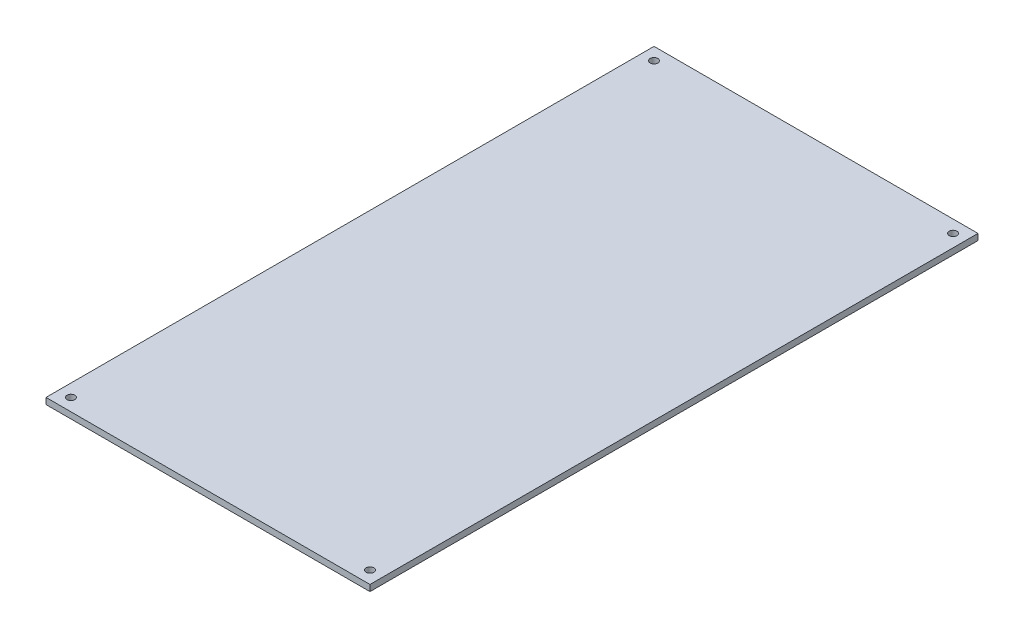
ISO-10303-21;
HEADER;
FILE_DESCRIPTION(('STEP AP214'),'2;1');
FILE_NAME('part.step','',(''),(''),'','','');
FILE_SCHEMA(('AUTOMOTIVE_DESIGN { 1 0 10303 214 1 1 1 1 }'));
ENDSEC;
DATA;
#1=APPLICATION_CONTEXT('core data for automotive mechanical design processes');
#2=APPLICATION_PROTOCOL_DEFINITION('international standard','automotive_design',2000,#1);
#3=PRODUCT_CONTEXT('',#1,'mechanical');
#4=PRODUCT('Part','Part','',(#3));
#5=PRODUCT_RELATED_PRODUCT_CATEGORY('part','',(#4));
#6=PRODUCT_DEFINITION_FORMATION('','',#4);
#7=PRODUCT_DEFINITION_CONTEXT('part definition',#1,'design');
#8=PRODUCT_DEFINITION('design','',#6,#7);
#9=PRODUCT_DEFINITION_SHAPE('','',#8);
#10=(LENGTH_UNIT() NAMED_UNIT(*) SI_UNIT(.MILLI.,.METRE.));
#11=(NAMED_UNIT(*) PLANE_ANGLE_UNIT() SI_UNIT($,.RADIAN.));
#12=(NAMED_UNIT(*) SI_UNIT($,.STERADIAN.) SOLID_ANGLE_UNIT());
#13=UNCERTAINTY_MEASURE_WITH_UNIT(LENGTH_MEASURE(1.E-05),#10,'distance_accuracy_value','');
#14=(GEOMETRIC_REPRESENTATION_CONTEXT(3) GLOBAL_UNCERTAINTY_ASSIGNED_CONTEXT((#13)) GLOBAL_UNIT_ASSIGNED_CONTEXT((#10,
#11,#12)) REPRESENTATION_CONTEXT('',''));
#15=CARTESIAN_POINT('',(0.,0.,0.));
#16=DIRECTION('',(0.,0.,1.));
#17=DIRECTION('',(1.,0.,0.));
#18=AXIS2_PLACEMENT_3D('',#15,#16,#17);
#19=CARTESIAN_POINT('',(-799.199999922292,-85.54720046522,-6.44524953478061));
#20=DIRECTION('',(0.,1.,0.));
#21=DIRECTION('',(0.,0.,1.));
#22=AXIS2_PLACEMENT_3D('',#19,#20,#21);
#23=PLANE('',#22);
#24=CARTESIAN_POINT('',(-786.499999922292,-85.54720046522,-19.1452495347806));
#25=DIRECTION('',(0.,1.,0.));
#26=DIRECTION('',(0.,0.,1.));
#27=AXIS2_PLACEMENT_3D('',#24,#25,#26);
#28=CIRCLE('',#27,3.96874999999999);
#29=CARTESIAN_POINT('',(-786.499999922292,-85.54720046522,-15.1764995347806));
#30=VERTEX_POINT('',#29);
#31=EDGE_CURVE('E120',#30,#30,#28,.T.);
#32=ORIENTED_EDGE('',*,*,#31,.F.);
#33=EDGE_LOOP('',(#32));
#34=FACE_BOUND('',#33,.T.);
#35=CARTESIAN_POINT('',(-481.699999946945,-85.5472004652202,-613.445250040058));
#36=DIRECTION('',(0.,1.,0.));
#37=DIRECTION('',(0.,0.,1.));
#38=AXIS2_PLACEMENT_3D('',#35,#36,#37);
#39=CIRCLE('',#38,3.96875000000003);
#40=CARTESIAN_POINT('',(-481.699999946945,-85.5472004652202,-609.476500040058));
#41=VERTEX_POINT('',#40);
#42=EDGE_CURVE('E99',#41,#41,#39,.T.);
#43=ORIENTED_EDGE('',*,*,#42,.F.);
#44=EDGE_LOOP('',(#43));
#45=FACE_BOUND('',#44,.T.);
#46=DIRECTION('',(0.,0.,1.));
#47=VECTOR('',#46,1.);
#48=CARTESIAN_POINT('',(-799.199999922292,-85.5472004652202,-626.145250033137));
#49=LINE('',#48,#47);
#50=CARTESIAN_POINT('',(-799.199999922292,-85.5472004652202,-626.145250033137));
#51=VERTEX_POINT('',#50);
#52=CARTESIAN_POINT('',(-799.199999922292,-85.54720046522,-6.44524953478061));
#53=VERTEX_POINT('',#52);
#54=EDGE_CURVE('E84',#51,#53,#49,.T.);
#55=ORIENTED_EDGE('',*,*,#54,.T.);
#56=DIRECTION('',(1.,0.,0.));
#57=VECTOR('',#56,1.);
#58=CARTESIAN_POINT('',(-799.199999922292,-85.54720046522,-6.44524953478061));
#59=LINE('',#58,#57);
#60=CARTESIAN_POINT('',(-468.999999918198,-85.54720046522,-6.44524953478061));
#61=VERTEX_POINT('',#60);
#62=EDGE_CURVE('E79',#53,#61,#59,.T.);
#63=ORIENTED_EDGE('',*,*,#62,.T.);
#64=DIRECTION('',(0.,0.,-1.));
#65=VECTOR('',#64,1.);
#66=CARTESIAN_POINT('',(-468.999999918198,-85.5472004652202,-626.145250033137));
#67=LINE('',#66,#65);
#68=CARTESIAN_POINT('',(-468.999999918198,-85.5472004652202,-626.145250033137));
#69=VERTEX_POINT('',#68);
#70=EDGE_CURVE('E82',#61,#69,#67,.T.);
#71=ORIENTED_EDGE('',*,*,#70,.T.);
#72=DIRECTION('',(-1.,0.,0.));
#73=VECTOR('',#72,1.);
#74=CARTESIAN_POINT('',(-799.199999922292,-85.5472004652202,-626.145250033137));
#75=LINE('',#74,#73);
#76=EDGE_CURVE('E49',#69,#51,#75,.T.);
#77=ORIENTED_EDGE('',*,*,#76,.T.);
#78=EDGE_LOOP('',(#55,#63,#71,#77));
#79=FACE_BOUND('',#78,.T.);
#80=CARTESIAN_POINT('',(-786.499999946995,-85.5472004652202,-613.445250033137));
#81=DIRECTION('',(0.,1.,0.));
#82=DIRECTION('',(0.,0.,1.));
#83=AXIS2_PLACEMENT_3D('',#80,#81,#82);
#84=CIRCLE('',#83,3.96875000000009);
#85=CARTESIAN_POINT('',(-786.499999946995,-85.5472004652202,-609.476500033137));
#86=VERTEX_POINT('',#85);
#87=EDGE_CURVE('E114',#86,#86,#84,.T.);
#88=ORIENTED_EDGE('',*,*,#87,.F.);
#89=EDGE_LOOP('',(#88));
#90=FACE_BOUND('',#89,.T.);
#91=CARTESIAN_POINT('',(-481.699999918198,-85.54720046522,-19.1452500000077));
#92=DIRECTION('',(0.,1.,0.));
#93=DIRECTION('',(0.,0.,1.));
#94=AXIS2_PLACEMENT_3D('',#91,#92,#93);
#95=CIRCLE('',#94,3.96874999999999);
#96=CARTESIAN_POINT('',(-481.699999918198,-85.54720046522,-15.1765000000077));
#97=VERTEX_POINT('',#96);
#98=EDGE_CURVE('E126',#97,#97,#95,.T.);
#99=ORIENTED_EDGE('',*,*,#98,.F.);
#100=EDGE_LOOP('',(#99));
#101=FACE_BOUND('',#100,.T.);
#102=ADVANCED_FACE('F32',(#34,#45,#79,#90,#101),#23,.T.);
#103=CARTESIAN_POINT('',(-799.199999922292,-91.89720046522,-6.44524953478061));
#104=DIRECTION('',(0.,1.,0.));
#105=DIRECTION('',(0.,0.,1.));
#106=AXIS2_PLACEMENT_3D('',#103,#104,#105);
#107=PLANE('',#106);
#108=CARTESIAN_POINT('',(-786.499999922292,-91.89720046522,-19.1452495347806));
#109=DIRECTION('',(0.,1.,0.));
#110=DIRECTION('',(0.,0.,1.));
#111=AXIS2_PLACEMENT_3D('',#108,#109,#110);
#112=CIRCLE('',#111,3.96874999999999);
#113=CARTESIAN_POINT('',(-786.499999922292,-91.89720046522,-15.1764995347806));
#114=VERTEX_POINT('',#113);
#115=EDGE_CURVE('E123',#114,#114,#112,.T.);
#116=ORIENTED_EDGE('',*,*,#115,.T.);
#117=EDGE_LOOP('',(#116));
#118=FACE_BOUND('',#117,.T.);
#119=CARTESIAN_POINT('',(-481.699999946945,-91.8972004652202,-613.445250040058));
#120=DIRECTION('',(0.,1.,0.));
#121=DIRECTION('',(0.,0.,1.));
#122=AXIS2_PLACEMENT_3D('',#119,#120,#121);
#123=CIRCLE('',#122,3.96875000000003);
#124=CARTESIAN_POINT('',(-481.699999946945,-91.8972004652202,-609.476500040058));
#125=VERTEX_POINT('',#124);
#126=EDGE_CURVE('E111',#125,#125,#123,.T.);
#127=ORIENTED_EDGE('',*,*,#126,.T.);
#128=EDGE_LOOP('',(#127));
#129=FACE_BOUND('',#128,.T.);
#130=DIRECTION('',(0.,0.,1.));
#131=VECTOR('',#130,1.);
#132=CARTESIAN_POINT('',(-799.199999922292,-91.8972004652202,-626.145250033137));
#133=LINE('',#132,#131);
#134=CARTESIAN_POINT('',(-799.199999922292,-91.8972004652202,-626.145250033137));
#135=VERTEX_POINT('',#134);
#136=CARTESIAN_POINT('',(-799.199999922292,-91.89720046522,-6.44524953478061));
#137=VERTEX_POINT('',#136);
#138=EDGE_CURVE('E96',#135,#137,#133,.T.);
#139=ORIENTED_EDGE('',*,*,#138,.F.);
#140=DIRECTION('',(-1.,0.,0.));
#141=VECTOR('',#140,1.);
#142=CARTESIAN_POINT('',(-799.199999922292,-91.8972004652202,-626.145250033137));
#143=LINE('',#142,#141);
#144=CARTESIAN_POINT('',(-468.999999918198,-91.8972004652202,-626.145250033137));
#145=VERTEX_POINT('',#144);
#146=EDGE_CURVE('E72',#145,#135,#143,.T.);
#147=ORIENTED_EDGE('',*,*,#146,.F.);
#148=DIRECTION('',(0.,0.,-1.));
#149=VECTOR('',#148,1.);
#150=CARTESIAN_POINT('',(-468.999999918198,-91.8972004652202,-626.145250033137));
#151=LINE('',#150,#149);
#152=CARTESIAN_POINT('',(-468.999999918198,-91.89720046522,-6.44524953478061));
#153=VERTEX_POINT('',#152);
#154=EDGE_CURVE('E66',#153,#145,#151,.T.);
#155=ORIENTED_EDGE('',*,*,#154,.F.);
#156=DIRECTION('',(1.,0.,0.));
#157=VECTOR('',#156,1.);
#158=CARTESIAN_POINT('',(-799.199999922292,-91.89720046522,-6.44524953478061));
#159=LINE('',#158,#157);
#160=EDGE_CURVE('E88',#137,#153,#159,.T.);
#161=ORIENTED_EDGE('',*,*,#160,.F.);
#162=EDGE_LOOP('',(#139,#147,#155,#161));
#163=FACE_BOUND('',#162,.T.);
#164=CARTESIAN_POINT('',(-786.499999946995,-91.8972004652202,-613.445250033137));
#165=DIRECTION('',(0.,1.,0.));
#166=DIRECTION('',(0.,0.,1.));
#167=AXIS2_PLACEMENT_3D('',#164,#165,#166);
#168=CIRCLE('',#167,3.96875000000009);
#169=CARTESIAN_POINT('',(-786.499999946995,-91.8972004652202,-609.476500033137));
#170=VERTEX_POINT('',#169);
#171=EDGE_CURVE('E117',#170,#170,#168,.T.);
#172=ORIENTED_EDGE('',*,*,#171,.T.);
#173=EDGE_LOOP('',(#172));
#174=FACE_BOUND('',#173,.T.);
#175=CARTESIAN_POINT('',(-481.699999918198,-91.89720046522,-19.1452500000077));
#176=DIRECTION('',(0.,1.,0.));
#177=DIRECTION('',(0.,0.,1.));
#178=AXIS2_PLACEMENT_3D('',#175,#176,#177);
#179=CIRCLE('',#178,3.96874999999999);
#180=CARTESIAN_POINT('',(-481.699999918198,-91.89720046522,-15.1765000000077));
#181=VERTEX_POINT('',#180);
#182=EDGE_CURVE('E129',#181,#181,#179,.T.);
#183=ORIENTED_EDGE('',*,*,#182,.T.);
#184=EDGE_LOOP('',(#183));
#185=FACE_BOUND('',#184,.T.);
#186=ADVANCED_FACE('F107',(#118,#129,#163,#174,#185),#107,.F.);
#187=CARTESIAN_POINT('',(-799.199999922292,-85.5472004652202,-626.145250033137));
#188=DIRECTION('',(1.,0.,0.));
#189=DIRECTION('',(0.,0.,-1.));
#190=AXIS2_PLACEMENT_3D('',#187,#188,#189);
#191=PLANE('',#190);
#192=ORIENTED_EDGE('',*,*,#138,.T.);
#193=DIRECTION('',(0.,-1.,0.));
#194=VECTOR('',#193,1.);
#195=CARTESIAN_POINT('',(-799.199999922292,-85.54720046522,-6.44524953478061));
#196=LINE('',#195,#194);
#197=EDGE_CURVE('E11',#53,#137,#196,.T.);
#198=ORIENTED_EDGE('',*,*,#197,.F.);
#199=ORIENTED_EDGE('',*,*,#54,.F.);
#200=DIRECTION('',(0.,-1.,0.));
#201=VECTOR('',#200,1.);
#202=CARTESIAN_POINT('',(-799.199999922292,-85.5472004652202,-626.145250033137));
#203=LINE('',#202,#201);
#204=EDGE_CURVE('E92',#51,#135,#203,.T.);
#205=ORIENTED_EDGE('',*,*,#204,.T.);
#206=EDGE_LOOP('',(#192,#198,#199,#205));
#207=FACE_BOUND('',#206,.T.);
#208=ADVANCED_FACE('F34',(#207),#191,.F.);
#209=CARTESIAN_POINT('',(-799.199999922292,-85.54720046522,-6.44524953478061));
#210=DIRECTION('',(0.,0.,-1.));
#211=DIRECTION('',(0.,1.,0.));
#212=AXIS2_PLACEMENT_3D('',#209,#210,#211);
#213=PLANE('',#212);
#214=ORIENTED_EDGE('',*,*,#160,.T.);
#215=DIRECTION('',(0.,-1.,0.));
#216=VECTOR('',#215,1.);
#217=CARTESIAN_POINT('',(-468.999999918198,-85.54720046522,-6.44524953478061));
#218=LINE('',#217,#216);
#219=EDGE_CURVE('E41',#61,#153,#218,.T.);
#220=ORIENTED_EDGE('',*,*,#219,.F.);
#221=ORIENTED_EDGE('',*,*,#62,.F.);
#222=ORIENTED_EDGE('',*,*,#197,.T.);
#223=EDGE_LOOP('',(#214,#220,#221,#222));
#224=FACE_BOUND('',#223,.T.);
#225=ADVANCED_FACE('F87',(#224),#213,.F.);
#226=CARTESIAN_POINT('',(-468.999999918198,-85.5472004652202,-626.145250033137));
#227=DIRECTION('',(-1.,0.,0.));
#228=DIRECTION('',(0.,0.,1.));
#229=AXIS2_PLACEMENT_3D('',#226,#227,#228);
#230=PLANE('',#229);
#231=ORIENTED_EDGE('',*,*,#154,.T.);
#232=DIRECTION('',(0.,-1.,0.));
#233=VECTOR('',#232,1.);
#234=CARTESIAN_POINT('',(-468.999999918198,-85.5472004652202,-626.145250033137));
#235=LINE('',#234,#233);
#236=EDGE_CURVE('E89',#69,#145,#235,.T.);
#237=ORIENTED_EDGE('',*,*,#236,.F.);
#238=ORIENTED_EDGE('',*,*,#70,.F.);
#239=ORIENTED_EDGE('',*,*,#219,.T.);
#240=EDGE_LOOP('',(#231,#237,#238,#239));
#241=FACE_BOUND('',#240,.T.);
#242=ADVANCED_FACE('F90',(#241),#230,.F.);
#243=CARTESIAN_POINT('',(-799.199999922292,-85.5472004652202,-626.145250033137));
#244=DIRECTION('',(0.,0.,1.));
#245=DIRECTION('',(0.,-1.,0.));
#246=AXIS2_PLACEMENT_3D('',#243,#244,#245);
#247=PLANE('',#246);
#248=ORIENTED_EDGE('',*,*,#146,.T.);
#249=ORIENTED_EDGE('',*,*,#204,.F.);
#250=ORIENTED_EDGE('',*,*,#76,.F.);
#251=ORIENTED_EDGE('',*,*,#236,.T.);
#252=EDGE_LOOP('',(#248,#249,#250,#251));
#253=FACE_BOUND('',#252,.T.);
#254=ADVANCED_FACE('F104',(#253),#247,.F.);
#255=CARTESIAN_POINT('',(-481.699999946945,-85.5472004652202,-613.445250040058));
#256=DIRECTION('',(0.,-1.,0.));
#257=DIRECTION('',(0.,0.,-1.));
#258=AXIS2_PLACEMENT_3D('',#255,#256,#257);
#259=CYLINDRICAL_SURFACE('',#258,3.96875000000003);
#260=ORIENTED_EDGE('',*,*,#42,.T.);
#261=EDGE_LOOP('',(#260));
#262=FACE_BOUND('',#261,.T.);
#263=ORIENTED_EDGE('',*,*,#126,.F.);
#264=EDGE_LOOP('',(#263));
#265=FACE_BOUND('',#264,.T.);
#266=ADVANCED_FACE('F149',(#262,#265),#259,.F.);
#267=CARTESIAN_POINT('',(-786.499999946995,-85.5472004652202,-613.445250033137));
#268=DIRECTION('',(0.,-1.,0.));
#269=DIRECTION('',(0.,0.,-1.));
#270=AXIS2_PLACEMENT_3D('',#267,#268,#269);
#271=CYLINDRICAL_SURFACE('',#270,3.96875000000009);
#272=ORIENTED_EDGE('',*,*,#87,.T.);
#273=EDGE_LOOP('',(#272));
#274=FACE_BOUND('',#273,.T.);
#275=ORIENTED_EDGE('',*,*,#171,.F.);
#276=EDGE_LOOP('',(#275));
#277=FACE_BOUND('',#276,.T.);
#278=ADVANCED_FACE('F195',(#274,#277),#271,.F.);
#279=CARTESIAN_POINT('',(-786.499999922292,-85.54720046522,-19.1452495347806));
#280=DIRECTION('',(0.,-1.,0.));
#281=DIRECTION('',(0.,0.,-1.));
#282=AXIS2_PLACEMENT_3D('',#279,#280,#281);
#283=CYLINDRICAL_SURFACE('',#282,3.96874999999999);
#284=ORIENTED_EDGE('',*,*,#31,.T.);
#285=EDGE_LOOP('',(#284));
#286=FACE_BOUND('',#285,.T.);
#287=ORIENTED_EDGE('',*,*,#115,.F.);
#288=EDGE_LOOP('',(#287));
#289=FACE_BOUND('',#288,.T.);
#290=ADVANCED_FACE('F203',(#286,#289),#283,.F.);
#291=CARTESIAN_POINT('',(-481.699999918198,-85.54720046522,-19.1452500000077));
#292=DIRECTION('',(0.,-1.,0.));
#293=DIRECTION('',(0.,0.,-1.));
#294=AXIS2_PLACEMENT_3D('',#291,#292,#293);
#295=CYLINDRICAL_SURFACE('',#294,3.96874999999999);
#296=ORIENTED_EDGE('',*,*,#98,.T.);
#297=EDGE_LOOP('',(#296));
#298=FACE_BOUND('',#297,.T.);
#299=ORIENTED_EDGE('',*,*,#182,.F.);
#300=EDGE_LOOP('',(#299));
#301=FACE_BOUND('',#300,.T.);
#302=ADVANCED_FACE('F135',(#298,#301),#295,.F.);
#303=CLOSED_SHELL('',(#102,#186,#208,#225,#242,#254,#266,#278,#290,#302));
#304=MANIFOLD_SOLID_BREP('B2',#303);
#305=ADVANCED_BREP_SHAPE_REPRESENTATION('',(#18,#304),#14);
#306=SHAPE_DEFINITION_REPRESENTATION(#9,#305);
ENDSEC;
END-ISO-10303-21;
